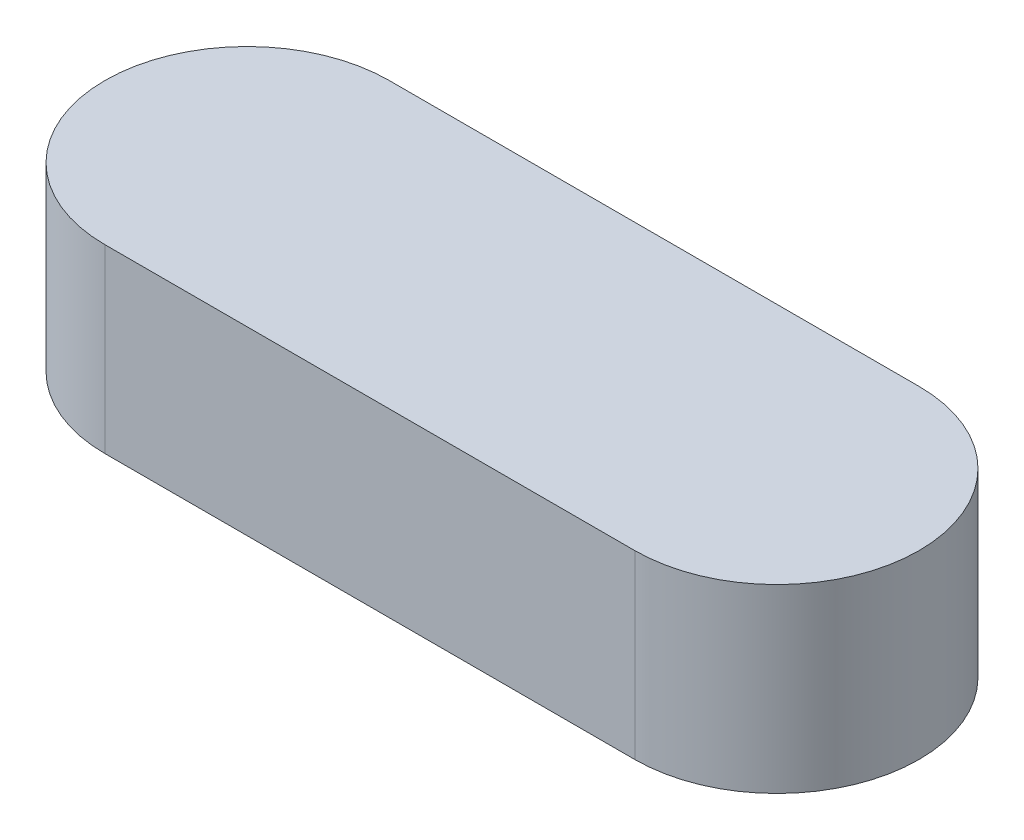
ISO-10303-21;
HEADER;
FILE_DESCRIPTION(('STEP AP214'),'2;1');
FILE_NAME('part.step','',(''),(''),'','','');
FILE_SCHEMA(('AUTOMOTIVE_DESIGN { 1 0 10303 214 1 1 1 1 }'));
ENDSEC;
DATA;
#1=APPLICATION_CONTEXT('core data for automotive mechanical design processes');
#2=APPLICATION_PROTOCOL_DEFINITION('international standard','automotive_design',2000,#1);
#3=PRODUCT_CONTEXT('',#1,'mechanical');
#4=PRODUCT('Part','Part','',(#3));
#5=PRODUCT_RELATED_PRODUCT_CATEGORY('part','',(#4));
#6=PRODUCT_DEFINITION_FORMATION('','',#4);
#7=PRODUCT_DEFINITION_CONTEXT('part definition',#1,'design');
#8=PRODUCT_DEFINITION('design','',#6,#7);
#9=PRODUCT_DEFINITION_SHAPE('','',#8);
#10=(LENGTH_UNIT() NAMED_UNIT(*) SI_UNIT(.MILLI.,.METRE.));
#11=(NAMED_UNIT(*) PLANE_ANGLE_UNIT() SI_UNIT($,.RADIAN.));
#12=(NAMED_UNIT(*) SI_UNIT($,.STERADIAN.) SOLID_ANGLE_UNIT());
#13=UNCERTAINTY_MEASURE_WITH_UNIT(LENGTH_MEASURE(1.E-05),#10,'distance_accuracy_value','');
#14=(GEOMETRIC_REPRESENTATION_CONTEXT(3) GLOBAL_UNCERTAINTY_ASSIGNED_CONTEXT((#13)) GLOBAL_UNIT_ASSIGNED_CONTEXT((#10,
#11,#12)) REPRESENTATION_CONTEXT('',''));
#15=CARTESIAN_POINT('',(0.,0.,0.));
#16=DIRECTION('',(0.,0.,1.));
#17=DIRECTION('',(1.,0.,0.));
#18=AXIS2_PLACEMENT_3D('',#15,#16,#17);
#19=CARTESIAN_POINT('',(20.5,14.,0.));
#20=DIRECTION('',(0.,-1.,0.));
#21=DIRECTION('',(0.,0.,-1.));
#22=AXIS2_PLACEMENT_3D('',#19,#20,#21);
#23=CYLINDRICAL_SURFACE('',#22,11.);
#24=CARTESIAN_POINT('',(20.5,0.,0.));
#25=DIRECTION('',(0.,1.,0.));
#26=DIRECTION('',(0.,0.,1.));
#27=AXIS2_PLACEMENT_3D('',#24,#25,#26);
#28=CIRCLE('',#27,11.);
#29=CARTESIAN_POINT('',(20.5,0.,11.));
#30=VERTEX_POINT('',#29);
#31=CARTESIAN_POINT('',(20.5,0.,-11.));
#32=VERTEX_POINT('',#31);
#33=EDGE_CURVE('E107',#30,#32,#28,.T.);
#34=ORIENTED_EDGE('',*,*,#33,.T.);
#35=DIRECTION('',(0.,-1.,0.));
#36=VECTOR('',#35,1.);
#37=CARTESIAN_POINT('',(20.5,14.,-11.));
#38=LINE('',#37,#36);
#39=CARTESIAN_POINT('',(20.5,14.,-11.));
#40=VERTEX_POINT('',#39);
#41=EDGE_CURVE('E11',#40,#32,#38,.T.);
#42=ORIENTED_EDGE('',*,*,#41,.F.);
#43=CARTESIAN_POINT('',(20.5,14.,0.));
#44=DIRECTION('',(0.,1.,0.));
#45=DIRECTION('',(0.,0.,1.));
#46=AXIS2_PLACEMENT_3D('',#43,#44,#45);
#47=CIRCLE('',#46,11.);
#48=CARTESIAN_POINT('',(20.5,14.,11.));
#49=VERTEX_POINT('',#48);
#50=EDGE_CURVE('E91',#49,#40,#47,.T.);
#51=ORIENTED_EDGE('',*,*,#50,.F.);
#52=DIRECTION('',(0.,-1.,0.));
#53=VECTOR('',#52,1.);
#54=CARTESIAN_POINT('',(20.5,14.,11.));
#55=LINE('',#54,#53);
#56=EDGE_CURVE('E103',#49,#30,#55,.T.);
#57=ORIENTED_EDGE('',*,*,#56,.T.);
#58=EDGE_LOOP('',(#34,#42,#51,#57));
#59=FACE_BOUND('',#58,.T.);
#60=ADVANCED_FACE('F39',(#59),#23,.T.);
#61=CARTESIAN_POINT('',(20.5,14.,-11.));
#62=DIRECTION('',(0.,0.,1.));
#63=DIRECTION('',(1.,0.,0.));
#64=AXIS2_PLACEMENT_3D('',#61,#62,#63);
#65=PLANE('',#64);
#66=DIRECTION('',(-1.,0.,0.));
#67=VECTOR('',#66,1.);
#68=CARTESIAN_POINT('',(20.5,0.,-11.));
#69=LINE('',#68,#67);
#70=CARTESIAN_POINT('',(-20.5,0.,-11.));
#71=VERTEX_POINT('',#70);
#72=EDGE_CURVE('E96',#32,#71,#69,.T.);
#73=ORIENTED_EDGE('',*,*,#72,.T.);
#74=DIRECTION('',(0.,-1.,0.));
#75=VECTOR('',#74,1.);
#76=CARTESIAN_POINT('',(-20.5,14.,-11.));
#77=LINE('',#76,#75);
#78=CARTESIAN_POINT('',(-20.5,14.,-11.));
#79=VERTEX_POINT('',#78);
#80=EDGE_CURVE('E48',#79,#71,#77,.T.);
#81=ORIENTED_EDGE('',*,*,#80,.F.);
#82=DIRECTION('',(-1.,0.,0.));
#83=VECTOR('',#82,1.);
#84=CARTESIAN_POINT('',(20.5,14.,-11.));
#85=LINE('',#84,#83);
#86=EDGE_CURVE('E86',#40,#79,#85,.T.);
#87=ORIENTED_EDGE('',*,*,#86,.F.);
#88=ORIENTED_EDGE('',*,*,#41,.T.);
#89=EDGE_LOOP('',(#73,#81,#87,#88));
#90=FACE_BOUND('',#89,.T.);
#91=ADVANCED_FACE('F95',(#90),#65,.F.);
#92=CARTESIAN_POINT('',(-20.5,14.,0.));
#93=DIRECTION('',(0.,-1.,0.));
#94=DIRECTION('',(0.,0.,-1.));
#95=AXIS2_PLACEMENT_3D('',#92,#93,#94);
#96=CYLINDRICAL_SURFACE('',#95,11.);
#97=CARTESIAN_POINT('',(-20.5,0.,0.));
#98=DIRECTION('',(0.,1.,0.));
#99=DIRECTION('',(0.,0.,1.));
#100=AXIS2_PLACEMENT_3D('',#97,#98,#99);
#101=CIRCLE('',#100,11.);
#102=CARTESIAN_POINT('',(-20.5,0.,11.));
#103=VERTEX_POINT('',#102);
#104=EDGE_CURVE('E73',#71,#103,#101,.T.);
#105=ORIENTED_EDGE('',*,*,#104,.T.);
#106=DIRECTION('',(0.,-1.,0.));
#107=VECTOR('',#106,1.);
#108=CARTESIAN_POINT('',(-20.5,14.,11.));
#109=LINE('',#108,#107);
#110=CARTESIAN_POINT('',(-20.5,14.,11.));
#111=VERTEX_POINT('',#110);
#112=EDGE_CURVE('E98',#111,#103,#109,.T.);
#113=ORIENTED_EDGE('',*,*,#112,.F.);
#114=CARTESIAN_POINT('',(-20.5,14.,0.));
#115=DIRECTION('',(0.,1.,0.));
#116=DIRECTION('',(0.,0.,1.));
#117=AXIS2_PLACEMENT_3D('',#114,#115,#116);
#118=CIRCLE('',#117,11.);
#119=EDGE_CURVE('E89',#79,#111,#118,.T.);
#120=ORIENTED_EDGE('',*,*,#119,.F.);
#121=ORIENTED_EDGE('',*,*,#80,.T.);
#122=EDGE_LOOP('',(#105,#113,#120,#121));
#123=FACE_BOUND('',#122,.T.);
#124=ADVANCED_FACE('F99',(#123),#96,.T.);
#125=CARTESIAN_POINT('',(20.5,14.,11.));
#126=DIRECTION('',(0.,0.,-1.));
#127=DIRECTION('',(-1.,0.,0.));
#128=AXIS2_PLACEMENT_3D('',#125,#126,#127);
#129=PLANE('',#128);
#130=DIRECTION('',(1.,0.,0.));
#131=VECTOR('',#130,1.);
#132=CARTESIAN_POINT('',(20.5,0.,11.));
#133=LINE('',#132,#131);
#134=EDGE_CURVE('E79',#103,#30,#133,.T.);
#135=ORIENTED_EDGE('',*,*,#134,.T.);
#136=ORIENTED_EDGE('',*,*,#56,.F.);
#137=DIRECTION('',(1.,0.,0.));
#138=VECTOR('',#137,1.);
#139=CARTESIAN_POINT('',(20.5,14.,11.));
#140=LINE('',#139,#138);
#141=EDGE_CURVE('E56',#111,#49,#140,.T.);
#142=ORIENTED_EDGE('',*,*,#141,.F.);
#143=ORIENTED_EDGE('',*,*,#112,.T.);
#144=EDGE_LOOP('',(#135,#136,#142,#143));
#145=FACE_BOUND('',#144,.T.);
#146=ADVANCED_FACE('F120',(#145),#129,.F.);
#147=CARTESIAN_POINT('',(20.5,14.,0.));
#148=DIRECTION('',(0.,1.,0.));
#149=DIRECTION('',(0.,0.,1.));
#150=AXIS2_PLACEMENT_3D('',#147,#148,#149);
#151=PLANE('',#150);
#152=ORIENTED_EDGE('',*,*,#50,.T.);
#153=ORIENTED_EDGE('',*,*,#86,.T.);
#154=ORIENTED_EDGE('',*,*,#119,.T.);
#155=ORIENTED_EDGE('',*,*,#141,.T.);
#156=EDGE_LOOP('',(#152,#153,#154,#155));
#157=FACE_BOUND('',#156,.T.);
#158=ADVANCED_FACE('F87',(#157),#151,.T.);
#159=CARTESIAN_POINT('',(20.5,0.,0.));
#160=DIRECTION('',(0.,1.,0.));
#161=DIRECTION('',(0.,0.,1.));
#162=AXIS2_PLACEMENT_3D('',#159,#160,#161);
#163=PLANE('',#162);
#164=ORIENTED_EDGE('',*,*,#33,.F.);
#165=ORIENTED_EDGE('',*,*,#134,.F.);
#166=ORIENTED_EDGE('',*,*,#104,.F.);
#167=ORIENTED_EDGE('',*,*,#72,.F.);
#168=EDGE_LOOP('',(#164,#165,#166,#167));
#169=FACE_BOUND('',#168,.T.);
#170=ADVANCED_FACE('F123',(#169),#163,.F.);
#171=CLOSED_SHELL('',(#60,#91,#124,#146,#158,#170));
#172=MANIFOLD_SOLID_BREP('B2',#171);
#173=ADVANCED_BREP_SHAPE_REPRESENTATION('',(#18,#172),#14);
#174=SHAPE_DEFINITION_REPRESENTATION(#9,#173);
ENDSEC;
END-ISO-10303-21;
